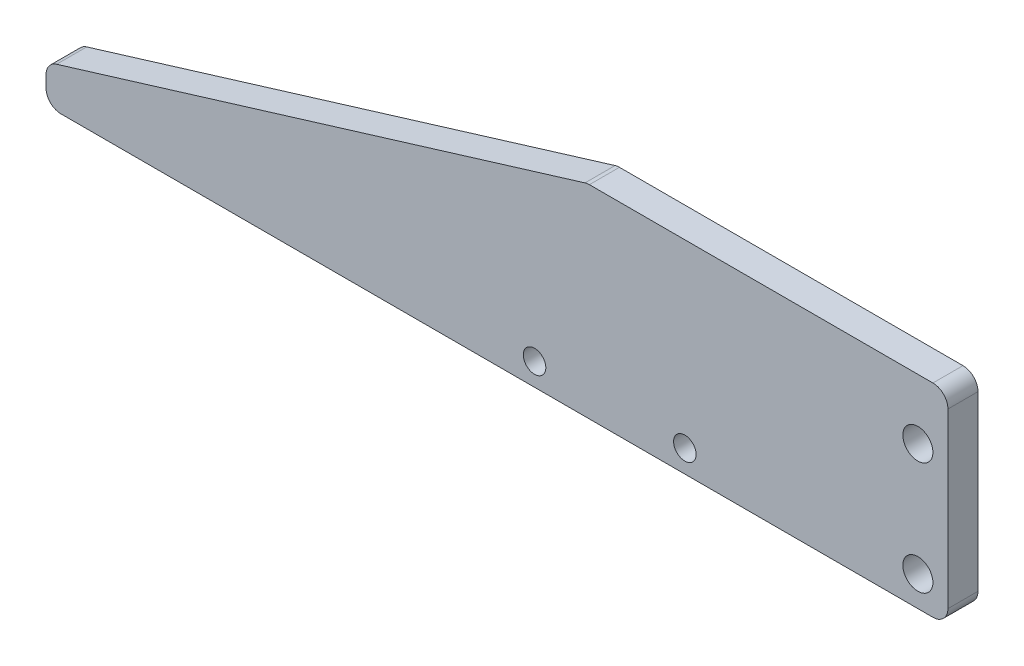
ISO-10303-21;
HEADER;
FILE_DESCRIPTION(('STEP AP214'),'2;1');
FILE_NAME('part.step','',(''),(''),'','','');
FILE_SCHEMA(('AUTOMOTIVE_DESIGN { 1 0 10303 214 1 1 1 1 }'));
ENDSEC;
DATA;
#1=APPLICATION_CONTEXT('core data for automotive mechanical design processes');
#2=APPLICATION_PROTOCOL_DEFINITION('international standard','automotive_design',2000,#1);
#3=PRODUCT_CONTEXT('',#1,'mechanical');
#4=PRODUCT('Part','Part','',(#3));
#5=PRODUCT_RELATED_PRODUCT_CATEGORY('part','',(#4));
#6=PRODUCT_DEFINITION_FORMATION('','',#4);
#7=PRODUCT_DEFINITION_CONTEXT('part definition',#1,'design');
#8=PRODUCT_DEFINITION('design','',#6,#7);
#9=PRODUCT_DEFINITION_SHAPE('','',#8);
#10=(LENGTH_UNIT() NAMED_UNIT(*) SI_UNIT(.MILLI.,.METRE.));
#11=(NAMED_UNIT(*) PLANE_ANGLE_UNIT() SI_UNIT($,.RADIAN.));
#12=(NAMED_UNIT(*) SI_UNIT($,.STERADIAN.) SOLID_ANGLE_UNIT());
#13=UNCERTAINTY_MEASURE_WITH_UNIT(LENGTH_MEASURE(1.E-05),#10,'distance_accuracy_value','');
#14=(GEOMETRIC_REPRESENTATION_CONTEXT(3) GLOBAL_UNCERTAINTY_ASSIGNED_CONTEXT((#13)) GLOBAL_UNIT_ASSIGNED_CONTEXT((#10,
#11,#12)) REPRESENTATION_CONTEXT('',''));
#15=CARTESIAN_POINT('',(0.,0.,0.));
#16=DIRECTION('',(0.,0.,1.));
#17=DIRECTION('',(1.,0.,0.));
#18=AXIS2_PLACEMENT_3D('',#15,#16,#17);
#19=CARTESIAN_POINT('',(0.,0.,4.));
#20=DIRECTION('',(0.,0.,1.));
#21=DIRECTION('',(1.,0.,0.));
#22=AXIS2_PLACEMENT_3D('',#19,#20,#21);
#23=PLANE('',#22);
#24=DIRECTION('',(-1.,0.,0.));
#25=VECTOR('',#24,1.);
#26=CARTESIAN_POINT('',(-60.,13.5,4.));
#27=LINE('',#26,#25);
#28=CARTESIAN_POINT('',(58.,13.5,4.));
#29=VERTEX_POINT('',#28);
#30=CARTESIAN_POINT('',(12.2987382635341,13.5,4.));
#31=VERTEX_POINT('',#30);
#32=EDGE_CURVE('E173',#29,#31,#27,.T.);
#33=ORIENTED_EDGE('',*,*,#32,.T.);
#34=CARTESIAN_POINT('',(12.2987382635341,11.5,4.));
#35=DIRECTION('',(0.,0.,1.));
#36=DIRECTION('',(1.,0.,0.));
#37=AXIS2_PLACEMENT_3D('',#34,#35,#36);
#38=CIRCLE('',#37,2.);
#39=CARTESIAN_POINT('',(11.714301192336,13.4127031421027,4.));
#40=VERTEX_POINT('',#39);
#41=EDGE_CURVE('E140',#31,#40,#38,.T.);
#42=ORIENTED_EDGE('',*,*,#41,.T.);
#43=DIRECTION('',(0.956351571051339,0.29221853559902,0.));
#44=VECTOR('',#43,1.);
#45=CARTESIAN_POINT('',(-2.74805928016937,8.99364855328158,4.));
#46=LINE('',#45,#44);
#47=CARTESIAN_POINT('',(-58.584437071198,-8.06746688286607,4.));
#48=VERTEX_POINT('',#47);
#49=EDGE_CURVE('E125',#48,#40,#46,.T.);
#50=ORIENTED_EDGE('',*,*,#49,.F.);
#51=CARTESIAN_POINT('',(-58.,-9.98017002496874,4.));
#52=DIRECTION('',(0.,0.,1.));
#53=DIRECTION('',(1.,0.,0.));
#54=AXIS2_PLACEMENT_3D('',#51,#52,#53);
#55=CIRCLE('',#54,2.);
#56=CARTESIAN_POINT('',(-60.,-9.98017002496874,4.));
#57=VERTEX_POINT('',#56);
#58=EDGE_CURVE('E137',#48,#57,#55,.T.);
#59=ORIENTED_EDGE('',*,*,#58,.T.);
#60=DIRECTION('',(0.,-1.,0.));
#61=VECTOR('',#60,1.);
#62=CARTESIAN_POINT('',(-60.,13.5,4.));
#63=LINE('',#62,#61);
#64=CARTESIAN_POINT('',(-60.,-11.5,4.));
#65=VERTEX_POINT('',#64);
#66=EDGE_CURVE('E167',#57,#65,#63,.T.);
#67=ORIENTED_EDGE('',*,*,#66,.T.);
#68=CARTESIAN_POINT('',(-58.,-11.5,4.));
#69=DIRECTION('',(0.,0.,1.));
#70=DIRECTION('',(1.,0.,0.));
#71=AXIS2_PLACEMENT_3D('',#68,#69,#70);
#72=CIRCLE('',#71,2.);
#73=CARTESIAN_POINT('',(-58.,-13.5,4.));
#74=VERTEX_POINT('',#73);
#75=EDGE_CURVE('E145',#65,#74,#72,.T.);
#76=ORIENTED_EDGE('',*,*,#75,.T.);
#77=DIRECTION('',(1.,0.,0.));
#78=VECTOR('',#77,1.);
#79=CARTESIAN_POINT('',(-60.,-13.5,4.));
#80=LINE('',#79,#78);
#81=CARTESIAN_POINT('',(58.,-13.5,4.));
#82=VERTEX_POINT('',#81);
#83=EDGE_CURVE('E132',#74,#82,#80,.T.);
#84=ORIENTED_EDGE('',*,*,#83,.T.);
#85=CARTESIAN_POINT('',(58.,-11.5,4.));
#86=DIRECTION('',(0.,0.,1.));
#87=DIRECTION('',(1.,0.,0.));
#88=AXIS2_PLACEMENT_3D('',#85,#86,#87);
#89=CIRCLE('',#88,2.);
#90=CARTESIAN_POINT('',(60.,-11.5,4.));
#91=VERTEX_POINT('',#90);
#92=EDGE_CURVE('E63',#82,#91,#89,.T.);
#93=ORIENTED_EDGE('',*,*,#92,.T.);
#94=DIRECTION('',(0.,1.,0.));
#95=VECTOR('',#94,1.);
#96=CARTESIAN_POINT('',(60.,13.5,4.));
#97=LINE('',#96,#95);
#98=CARTESIAN_POINT('',(60.,11.5,4.));
#99=VERTEX_POINT('',#98);
#100=EDGE_CURVE('E188',#91,#99,#97,.T.);
#101=ORIENTED_EDGE('',*,*,#100,.T.);
#102=CARTESIAN_POINT('',(58.,11.5,4.));
#103=DIRECTION('',(0.,0.,1.));
#104=DIRECTION('',(1.,0.,0.));
#105=AXIS2_PLACEMENT_3D('',#102,#103,#104);
#106=CIRCLE('',#105,2.);
#107=EDGE_CURVE('E147',#99,#29,#106,.T.);
#108=ORIENTED_EDGE('',*,*,#107,.T.);
#109=EDGE_LOOP('',(#33,#42,#50,#59,#67,#76,#84,#93,#101,#108));
#110=FACE_BOUND('',#109,.T.);
#111=CARTESIAN_POINT('',(25.,-10.5,4.));
#112=DIRECTION('',(0.,0.,1.));
#113=DIRECTION('',(1.,0.,0.));
#114=AXIS2_PLACEMENT_3D('',#111,#112,#113);
#115=CIRCLE('',#114,1.5);
#116=CARTESIAN_POINT('',(26.5,-10.5,4.));
#117=VERTEX_POINT('',#116);
#118=EDGE_CURVE('E225',#117,#117,#115,.T.);
#119=ORIENTED_EDGE('',*,*,#118,.F.);
#120=EDGE_LOOP('',(#119));
#121=FACE_BOUND('',#120,.T.);
#122=CARTESIAN_POINT('',(56.,5.5,4.));
#123=DIRECTION('',(0.,0.,1.));
#124=DIRECTION('',(1.,0.,0.));
#125=AXIS2_PLACEMENT_3D('',#122,#123,#124);
#126=CIRCLE('',#125,2.);
#127=CARTESIAN_POINT('',(58.,5.5,4.));
#128=VERTEX_POINT('',#127);
#129=EDGE_CURVE('E237',#128,#128,#126,.T.);
#130=ORIENTED_EDGE('',*,*,#129,.F.);
#131=EDGE_LOOP('',(#130));
#132=FACE_BOUND('',#131,.T.);
#133=CARTESIAN_POINT('',(56.,-9.5,4.));
#134=DIRECTION('',(0.,0.,1.));
#135=DIRECTION('',(1.,0.,0.));
#136=AXIS2_PLACEMENT_3D('',#133,#134,#135);
#137=CIRCLE('',#136,2.);
#138=CARTESIAN_POINT('',(58.,-9.5,4.));
#139=VERTEX_POINT('',#138);
#140=EDGE_CURVE('E231',#139,#139,#137,.T.);
#141=ORIENTED_EDGE('',*,*,#140,.F.);
#142=EDGE_LOOP('',(#141));
#143=FACE_BOUND('',#142,.T.);
#144=CARTESIAN_POINT('',(4.99999999999999,-10.5,4.));
#145=DIRECTION('',(0.,0.,1.));
#146=DIRECTION('',(1.,0.,0.));
#147=AXIS2_PLACEMENT_3D('',#144,#145,#146);
#148=CIRCLE('',#147,1.5);
#149=CARTESIAN_POINT('',(6.5,-10.5,4.));
#150=VERTEX_POINT('',#149);
#151=EDGE_CURVE('E219',#150,#150,#148,.T.);
#152=ORIENTED_EDGE('',*,*,#151,.F.);
#153=EDGE_LOOP('',(#152));
#154=FACE_BOUND('',#153,.T.);
#155=ADVANCED_FACE('F41',(#110,#121,#132,#143,#154),#23,.T.);
#156=CARTESIAN_POINT('',(0.,0.,0.));
#157=DIRECTION('',(0.,0.,1.));
#158=DIRECTION('',(1.,0.,0.));
#159=AXIS2_PLACEMENT_3D('',#156,#157,#158);
#160=PLANE('',#159);
#161=DIRECTION('',(-0.956351571051339,-0.29221853559902,0.));
#162=VECTOR('',#161,1.);
#163=CARTESIAN_POINT('',(-60.,-8.5,0.));
#164=LINE('',#163,#162);
#165=CARTESIAN_POINT('',(11.714301192336,13.4127031421027,0.));
#166=VERTEX_POINT('',#165);
#167=CARTESIAN_POINT('',(-58.584437071198,-8.06746688286606,0.));
#168=VERTEX_POINT('',#167);
#169=EDGE_CURVE('E128',#166,#168,#164,.T.);
#170=ORIENTED_EDGE('',*,*,#169,.F.);
#171=CARTESIAN_POINT('',(12.2987382635341,11.5,0.));
#172=DIRECTION('',(0.,0.,1.));
#173=DIRECTION('',(1.,0.,0.));
#174=AXIS2_PLACEMENT_3D('',#171,#172,#173);
#175=CIRCLE('',#174,2.);
#176=CARTESIAN_POINT('',(12.2987382635341,13.5,0.));
#177=VERTEX_POINT('',#176);
#178=EDGE_CURVE('E202',#166,#177,#175,.F.);
#179=ORIENTED_EDGE('',*,*,#178,.T.);
#180=DIRECTION('',(-1.,0.,0.));
#181=VECTOR('',#180,1.);
#182=CARTESIAN_POINT('',(-60.,13.5,0.));
#183=LINE('',#182,#181);
#184=CARTESIAN_POINT('',(58.,13.5,0.));
#185=VERTEX_POINT('',#184);
#186=EDGE_CURVE('E191',#185,#177,#183,.T.);
#187=ORIENTED_EDGE('',*,*,#186,.F.);
#188=CARTESIAN_POINT('',(58.,11.5,0.));
#189=DIRECTION('',(0.,0.,1.));
#190=DIRECTION('',(1.,0.,0.));
#191=AXIS2_PLACEMENT_3D('',#188,#189,#190);
#192=CIRCLE('',#191,2.);
#193=CARTESIAN_POINT('',(60.,11.5,0.));
#194=VERTEX_POINT('',#193);
#195=EDGE_CURVE('E200',#185,#194,#192,.F.);
#196=ORIENTED_EDGE('',*,*,#195,.T.);
#197=DIRECTION('',(0.,1.,0.));
#198=VECTOR('',#197,1.);
#199=CARTESIAN_POINT('',(60.,13.5,0.));
#200=LINE('',#199,#198);
#201=CARTESIAN_POINT('',(60.,-11.5,0.));
#202=VERTEX_POINT('',#201);
#203=EDGE_CURVE('E240',#202,#194,#200,.T.);
#204=ORIENTED_EDGE('',*,*,#203,.F.);
#205=CARTESIAN_POINT('',(58.,-11.5,0.));
#206=DIRECTION('',(0.,0.,1.));
#207=DIRECTION('',(1.,0.,0.));
#208=AXIS2_PLACEMENT_3D('',#205,#206,#207);
#209=CIRCLE('',#208,2.);
#210=CARTESIAN_POINT('',(58.,-13.5,0.));
#211=VERTEX_POINT('',#210);
#212=EDGE_CURVE('E187',#202,#211,#209,.F.);
#213=ORIENTED_EDGE('',*,*,#212,.T.);
#214=DIRECTION('',(1.,0.,0.));
#215=VECTOR('',#214,1.);
#216=CARTESIAN_POINT('',(-60.,-13.5,0.));
#217=LINE('',#216,#215);
#218=CARTESIAN_POINT('',(-58.,-13.5,0.));
#219=VERTEX_POINT('',#218);
#220=EDGE_CURVE('E181',#219,#211,#217,.T.);
#221=ORIENTED_EDGE('',*,*,#220,.F.);
#222=CARTESIAN_POINT('',(-58.,-11.5,0.));
#223=DIRECTION('',(0.,0.,1.));
#224=DIRECTION('',(1.,0.,0.));
#225=AXIS2_PLACEMENT_3D('',#222,#223,#224);
#226=CIRCLE('',#225,2.);
#227=CARTESIAN_POINT('',(-60.,-11.5,0.));
#228=VERTEX_POINT('',#227);
#229=EDGE_CURVE('E176',#219,#228,#226,.F.);
#230=ORIENTED_EDGE('',*,*,#229,.T.);
#231=DIRECTION('',(0.,-1.,0.));
#232=VECTOR('',#231,1.);
#233=CARTESIAN_POINT('',(-60.,13.5,0.));
#234=LINE('',#233,#232);
#235=CARTESIAN_POINT('',(-60.,-9.98017002496874,0.));
#236=VERTEX_POINT('',#235);
#237=EDGE_CURVE('E169',#236,#228,#234,.T.);
#238=ORIENTED_EDGE('',*,*,#237,.F.);
#239=CARTESIAN_POINT('',(-58.,-9.98017002496874,0.));
#240=DIRECTION('',(0.,0.,1.));
#241=DIRECTION('',(1.,0.,0.));
#242=AXIS2_PLACEMENT_3D('',#239,#240,#241);
#243=CIRCLE('',#242,2.);
#244=EDGE_CURVE('E197',#236,#168,#243,.F.);
#245=ORIENTED_EDGE('',*,*,#244,.T.);
#246=EDGE_LOOP('',(#170,#179,#187,#196,#204,#213,#221,#230,#238,#245));
#247=FACE_BOUND('',#246,.T.);
#248=CARTESIAN_POINT('',(56.,5.5,0.));
#249=DIRECTION('',(0.,0.,1.));
#250=DIRECTION('',(1.,0.,0.));
#251=AXIS2_PLACEMENT_3D('',#248,#249,#250);
#252=CIRCLE('',#251,2.);
#253=CARTESIAN_POINT('',(58.,5.5,0.));
#254=VERTEX_POINT('',#253);
#255=EDGE_CURVE('E234',#254,#254,#252,.T.);
#256=ORIENTED_EDGE('',*,*,#255,.T.);
#257=EDGE_LOOP('',(#256));
#258=FACE_BOUND('',#257,.T.);
#259=CARTESIAN_POINT('',(56.,-9.5,0.));
#260=DIRECTION('',(0.,0.,1.));
#261=DIRECTION('',(1.,0.,0.));
#262=AXIS2_PLACEMENT_3D('',#259,#260,#261);
#263=CIRCLE('',#262,2.);
#264=CARTESIAN_POINT('',(58.,-9.5,0.));
#265=VERTEX_POINT('',#264);
#266=EDGE_CURVE('E228',#265,#265,#263,.T.);
#267=ORIENTED_EDGE('',*,*,#266,.T.);
#268=EDGE_LOOP('',(#267));
#269=FACE_BOUND('',#268,.T.);
#270=CARTESIAN_POINT('',(25.,-10.5,0.));
#271=DIRECTION('',(0.,0.,1.));
#272=DIRECTION('',(1.,0.,0.));
#273=AXIS2_PLACEMENT_3D('',#270,#271,#272);
#274=CIRCLE('',#273,1.5);
#275=CARTESIAN_POINT('',(26.5,-10.5,0.));
#276=VERTEX_POINT('',#275);
#277=EDGE_CURVE('E222',#276,#276,#274,.T.);
#278=ORIENTED_EDGE('',*,*,#277,.T.);
#279=EDGE_LOOP('',(#278));
#280=FACE_BOUND('',#279,.T.);
#281=CARTESIAN_POINT('',(4.99999999999999,-10.5,0.));
#282=DIRECTION('',(0.,0.,1.));
#283=DIRECTION('',(1.,0.,0.));
#284=AXIS2_PLACEMENT_3D('',#281,#282,#283);
#285=CIRCLE('',#284,1.5);
#286=CARTESIAN_POINT('',(6.5,-10.5,0.));
#287=VERTEX_POINT('',#286);
#288=EDGE_CURVE('E141',#287,#287,#285,.T.);
#289=ORIENTED_EDGE('',*,*,#288,.T.);
#290=EDGE_LOOP('',(#289));
#291=FACE_BOUND('',#290,.T.);
#292=ADVANCED_FACE('F184',(#247,#258,#269,#280,#291),#160,.F.);
#293=CARTESIAN_POINT('',(60.,13.5,4.));
#294=DIRECTION('',(-1.,0.,0.));
#295=DIRECTION('',(0.,-1.,0.));
#296=AXIS2_PLACEMENT_3D('',#293,#294,#295);
#297=PLANE('',#296);
#298=ORIENTED_EDGE('',*,*,#203,.T.);
#299=DIRECTION('',(0.,0.,-1.));
#300=VECTOR('',#299,1.);
#301=CARTESIAN_POINT('',(60.,11.5,4.));
#302=LINE('',#301,#300);
#303=EDGE_CURVE('E56',#194,#99,#302,.F.);
#304=ORIENTED_EDGE('',*,*,#303,.T.);
#305=ORIENTED_EDGE('',*,*,#100,.F.);
#306=DIRECTION('',(0.,0.,-1.));
#307=VECTOR('',#306,1.);
#308=CARTESIAN_POINT('',(60.,-11.5,4.));
#309=LINE('',#308,#307);
#310=EDGE_CURVE('E155',#91,#202,#309,.T.);
#311=ORIENTED_EDGE('',*,*,#310,.T.);
#312=EDGE_LOOP('',(#298,#304,#305,#311));
#313=FACE_BOUND('',#312,.T.);
#314=ADVANCED_FACE('F244',(#313),#297,.F.);
#315=CARTESIAN_POINT('',(-60.,13.5,4.));
#316=DIRECTION('',(0.,-1.,0.));
#317=DIRECTION('',(0.,0.,-1.));
#318=AXIS2_PLACEMENT_3D('',#315,#316,#317);
#319=PLANE('',#318);
#320=ORIENTED_EDGE('',*,*,#186,.T.);
#321=DIRECTION('',(0.,0.,-1.));
#322=VECTOR('',#321,1.);
#323=CARTESIAN_POINT('',(12.2987382635341,13.5,4.));
#324=LINE('',#323,#322);
#325=EDGE_CURVE('E149',#177,#31,#324,.F.);
#326=ORIENTED_EDGE('',*,*,#325,.T.);
#327=ORIENTED_EDGE('',*,*,#32,.F.);
#328=DIRECTION('',(0.,0.,-1.));
#329=VECTOR('',#328,1.);
#330=CARTESIAN_POINT('',(58.,13.5,4.));
#331=LINE('',#330,#329);
#332=EDGE_CURVE('E204',#29,#185,#331,.T.);
#333=ORIENTED_EDGE('',*,*,#332,.T.);
#334=EDGE_LOOP('',(#320,#326,#327,#333));
#335=FACE_BOUND('',#334,.T.);
#336=ADVANCED_FACE('F210',(#335),#319,.F.);
#337=CARTESIAN_POINT('',(-60.,13.5,4.));
#338=DIRECTION('',(1.,0.,0.));
#339=DIRECTION('',(0.,0.,-1.));
#340=AXIS2_PLACEMENT_3D('',#337,#338,#339);
#341=PLANE('',#340);
#342=ORIENTED_EDGE('',*,*,#66,.F.);
#343=DIRECTION('',(0.,0.,-1.));
#344=VECTOR('',#343,1.);
#345=CARTESIAN_POINT('',(-60.,-9.98017002496874,4.));
#346=LINE('',#345,#344);
#347=EDGE_CURVE('E11',#57,#236,#346,.T.);
#348=ORIENTED_EDGE('',*,*,#347,.T.);
#349=ORIENTED_EDGE('',*,*,#237,.T.);
#350=DIRECTION('',(0.,0.,-1.));
#351=VECTOR('',#350,1.);
#352=CARTESIAN_POINT('',(-60.,-11.5,4.));
#353=LINE('',#352,#351);
#354=EDGE_CURVE('E49',#228,#65,#353,.F.);
#355=ORIENTED_EDGE('',*,*,#354,.T.);
#356=EDGE_LOOP('',(#342,#348,#349,#355));
#357=FACE_BOUND('',#356,.T.);
#358=ADVANCED_FACE('F166',(#357),#341,.F.);
#359=CARTESIAN_POINT('',(-60.,-13.5,4.));
#360=DIRECTION('',(0.,1.,0.));
#361=DIRECTION('',(0.,0.,1.));
#362=AXIS2_PLACEMENT_3D('',#359,#360,#361);
#363=PLANE('',#362);
#364=ORIENTED_EDGE('',*,*,#220,.T.);
#365=DIRECTION('',(0.,0.,-1.));
#366=VECTOR('',#365,1.);
#367=CARTESIAN_POINT('',(58.,-13.5,4.));
#368=LINE('',#367,#366);
#369=EDGE_CURVE('E162',#211,#82,#368,.F.);
#370=ORIENTED_EDGE('',*,*,#369,.T.);
#371=ORIENTED_EDGE('',*,*,#83,.F.);
#372=DIRECTION('',(0.,0.,-1.));
#373=VECTOR('',#372,1.);
#374=CARTESIAN_POINT('',(-58.,-13.5,4.));
#375=LINE('',#374,#373);
#376=EDGE_CURVE('E159',#74,#219,#375,.T.);
#377=ORIENTED_EDGE('',*,*,#376,.T.);
#378=EDGE_LOOP('',(#364,#370,#371,#377));
#379=FACE_BOUND('',#378,.T.);
#380=ADVANCED_FACE('F180',(#379),#363,.F.);
#381=CARTESIAN_POINT('',(56.,5.5,4.));
#382=DIRECTION('',(0.,0.,-1.));
#383=DIRECTION('',(-1.,0.,0.));
#384=AXIS2_PLACEMENT_3D('',#381,#382,#383);
#385=CYLINDRICAL_SURFACE('',#384,2.);
#386=ORIENTED_EDGE('',*,*,#129,.T.);
#387=EDGE_LOOP('',(#386));
#388=FACE_BOUND('',#387,.T.);
#389=ORIENTED_EDGE('',*,*,#255,.F.);
#390=EDGE_LOOP('',(#389));
#391=FACE_BOUND('',#390,.T.);
#392=ADVANCED_FACE('F265',(#388,#391),#385,.F.);
#393=CARTESIAN_POINT('',(56.,-9.5,4.));
#394=DIRECTION('',(0.,0.,-1.));
#395=DIRECTION('',(-1.,0.,0.));
#396=AXIS2_PLACEMENT_3D('',#393,#394,#395);
#397=CYLINDRICAL_SURFACE('',#396,2.);
#398=ORIENTED_EDGE('',*,*,#140,.T.);
#399=EDGE_LOOP('',(#398));
#400=FACE_BOUND('',#399,.T.);
#401=ORIENTED_EDGE('',*,*,#266,.F.);
#402=EDGE_LOOP('',(#401));
#403=FACE_BOUND('',#402,.T.);
#404=ADVANCED_FACE('F298',(#400,#403),#397,.F.);
#405=CARTESIAN_POINT('',(25.,-10.5,4.));
#406=DIRECTION('',(0.,0.,-1.));
#407=DIRECTION('',(-1.,0.,0.));
#408=AXIS2_PLACEMENT_3D('',#405,#406,#407);
#409=CYLINDRICAL_SURFACE('',#408,1.5);
#410=ORIENTED_EDGE('',*,*,#118,.T.);
#411=EDGE_LOOP('',(#410));
#412=FACE_BOUND('',#411,.T.);
#413=ORIENTED_EDGE('',*,*,#277,.F.);
#414=EDGE_LOOP('',(#413));
#415=FACE_BOUND('',#414,.T.);
#416=ADVANCED_FACE('F305',(#412,#415),#409,.F.);
#417=CARTESIAN_POINT('',(4.99999999999999,-10.5,4.));
#418=DIRECTION('',(0.,0.,-1.));
#419=DIRECTION('',(-1.,0.,0.));
#420=AXIS2_PLACEMENT_3D('',#417,#418,#419);
#421=CYLINDRICAL_SURFACE('',#420,1.5);
#422=ORIENTED_EDGE('',*,*,#151,.T.);
#423=EDGE_LOOP('',(#422));
#424=FACE_BOUND('',#423,.T.);
#425=ORIENTED_EDGE('',*,*,#288,.F.);
#426=EDGE_LOOP('',(#425));
#427=FACE_BOUND('',#426,.T.);
#428=ADVANCED_FACE('F312',(#424,#427),#421,.F.);
#429=CARTESIAN_POINT('',(-60.,-8.5,10.));
#430=DIRECTION('',(0.29221853559902,-0.956351571051339,0.));
#431=DIRECTION('',(0.956351571051339,0.29221853559902,0.));
#432=AXIS2_PLACEMENT_3D('',#429,#430,#431);
#433=PLANE('',#432);
#434=ORIENTED_EDGE('',*,*,#49,.T.);
#435=DIRECTION('',(0.,0.,-1.));
#436=VECTOR('',#435,1.);
#437=CARTESIAN_POINT('',(11.714301192336,13.4127031421027,10.));
#438=LINE('',#437,#436);
#439=EDGE_CURVE('E131',#40,#166,#438,.T.);
#440=ORIENTED_EDGE('',*,*,#439,.T.);
#441=ORIENTED_EDGE('',*,*,#169,.T.);
#442=DIRECTION('',(0.,0.,-1.));
#443=VECTOR('',#442,1.);
#444=CARTESIAN_POINT('',(-58.584437071198,-8.06746688286606,10.));
#445=LINE('',#444,#443);
#446=EDGE_CURVE('E121',#168,#48,#445,.F.);
#447=ORIENTED_EDGE('',*,*,#446,.T.);
#448=EDGE_LOOP('',(#434,#440,#441,#447));
#449=FACE_BOUND('',#448,.T.);
#450=ADVANCED_FACE('F123',(#449),#433,.F.);
#451=CARTESIAN_POINT('',(12.2987382635341,11.5,10.));
#452=DIRECTION('',(0.,0.,-1.));
#453=DIRECTION('',(-1.,0.,0.));
#454=AXIS2_PLACEMENT_3D('',#451,#452,#453);
#455=CYLINDRICAL_SURFACE('',#454,2.);
#456=ORIENTED_EDGE('',*,*,#41,.F.);
#457=ORIENTED_EDGE('',*,*,#325,.F.);
#458=ORIENTED_EDGE('',*,*,#178,.F.);
#459=ORIENTED_EDGE('',*,*,#439,.F.);
#460=EDGE_LOOP('',(#456,#457,#458,#459));
#461=FACE_BOUND('',#460,.T.);
#462=ADVANCED_FACE('F216',(#461),#455,.T.);
#463=CARTESIAN_POINT('',(58.,11.5,4.));
#464=DIRECTION('',(0.,0.,-1.));
#465=DIRECTION('',(-1.,0.,0.));
#466=AXIS2_PLACEMENT_3D('',#463,#464,#465);
#467=CYLINDRICAL_SURFACE('',#466,2.);
#468=ORIENTED_EDGE('',*,*,#107,.F.);
#469=ORIENTED_EDGE('',*,*,#303,.F.);
#470=ORIENTED_EDGE('',*,*,#195,.F.);
#471=ORIENTED_EDGE('',*,*,#332,.F.);
#472=EDGE_LOOP('',(#468,#469,#470,#471));
#473=FACE_BOUND('',#472,.T.);
#474=ADVANCED_FACE('F247',(#473),#467,.T.);
#475=CARTESIAN_POINT('',(58.,-11.5,4.));
#476=DIRECTION('',(0.,0.,-1.));
#477=DIRECTION('',(-1.,0.,0.));
#478=AXIS2_PLACEMENT_3D('',#475,#476,#477);
#479=CYLINDRICAL_SURFACE('',#478,2.);
#480=ORIENTED_EDGE('',*,*,#92,.F.);
#481=ORIENTED_EDGE('',*,*,#369,.F.);
#482=ORIENTED_EDGE('',*,*,#212,.F.);
#483=ORIENTED_EDGE('',*,*,#310,.F.);
#484=EDGE_LOOP('',(#480,#481,#482,#483));
#485=FACE_BOUND('',#484,.T.);
#486=ADVANCED_FACE('F249',(#485),#479,.T.);
#487=CARTESIAN_POINT('',(-58.,-9.98017002496874,4.));
#488=DIRECTION('',(0.,0.,-1.));
#489=DIRECTION('',(-1.,0.,0.));
#490=AXIS2_PLACEMENT_3D('',#487,#488,#489);
#491=CYLINDRICAL_SURFACE('',#490,2.);
#492=ORIENTED_EDGE('',*,*,#58,.F.);
#493=ORIENTED_EDGE('',*,*,#446,.F.);
#494=ORIENTED_EDGE('',*,*,#244,.F.);
#495=ORIENTED_EDGE('',*,*,#347,.F.);
#496=EDGE_LOOP('',(#492,#493,#494,#495));
#497=FACE_BOUND('',#496,.T.);
#498=ADVANCED_FACE('F144',(#497),#491,.T.);
#499=CARTESIAN_POINT('',(-58.,-11.5,4.));
#500=DIRECTION('',(0.,0.,-1.));
#501=DIRECTION('',(-1.,0.,0.));
#502=AXIS2_PLACEMENT_3D('',#499,#500,#501);
#503=CYLINDRICAL_SURFACE('',#502,2.);
#504=ORIENTED_EDGE('',*,*,#75,.F.);
#505=ORIENTED_EDGE('',*,*,#354,.F.);
#506=ORIENTED_EDGE('',*,*,#229,.F.);
#507=ORIENTED_EDGE('',*,*,#376,.F.);
#508=EDGE_LOOP('',(#504,#505,#506,#507));
#509=FACE_BOUND('',#508,.T.);
#510=ADVANCED_FACE('F43',(#509),#503,.T.);
#511=CLOSED_SHELL('',(#155,#292,#314,#336,#358,#380,#392,#404,#416,#428,#450,#462,#474,#486,
#498,#510));
#512=MANIFOLD_SOLID_BREP('B2',#511);
#513=ADVANCED_BREP_SHAPE_REPRESENTATION('',(#18,#512),#14);
#514=SHAPE_DEFINITION_REPRESENTATION(#9,#513);
ENDSEC;
END-ISO-10303-21;
